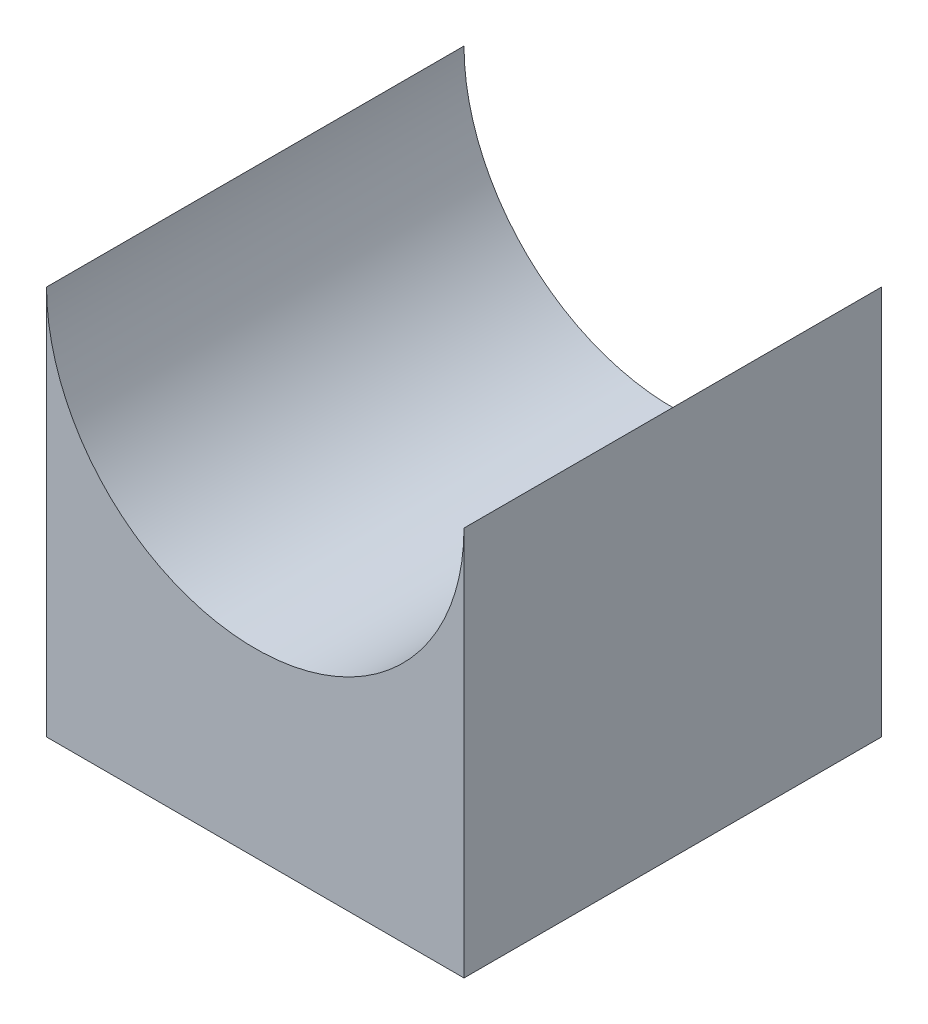
ISO-10303-21;
HEADER;
FILE_DESCRIPTION(('STEP AP214'),'2;1');
FILE_NAME('part.step','',(''),(''),'','','');
FILE_SCHEMA(('AUTOMOTIVE_DESIGN { 1 0 10303 214 1 1 1 1 }'));
ENDSEC;
DATA;
#1=APPLICATION_CONTEXT('core data for automotive mechanical design processes');
#2=APPLICATION_PROTOCOL_DEFINITION('international standard','automotive_design',2000,#1);
#3=PRODUCT_CONTEXT('',#1,'mechanical');
#4=PRODUCT('Part','Part','',(#3));
#5=PRODUCT_RELATED_PRODUCT_CATEGORY('part','',(#4));
#6=PRODUCT_DEFINITION_FORMATION('','',#4);
#7=PRODUCT_DEFINITION_CONTEXT('part definition',#1,'design');
#8=PRODUCT_DEFINITION('design','',#6,#7);
#9=PRODUCT_DEFINITION_SHAPE('','',#8);
#10=(LENGTH_UNIT() NAMED_UNIT(*) SI_UNIT(.MILLI.,.METRE.));
#11=(NAMED_UNIT(*) PLANE_ANGLE_UNIT() SI_UNIT($,.RADIAN.));
#12=(NAMED_UNIT(*) SI_UNIT($,.STERADIAN.) SOLID_ANGLE_UNIT());
#13=UNCERTAINTY_MEASURE_WITH_UNIT(LENGTH_MEASURE(1.E-05),#10,'distance_accuracy_value','');
#14=(GEOMETRIC_REPRESENTATION_CONTEXT(3) GLOBAL_UNCERTAINTY_ASSIGNED_CONTEXT((#13)) GLOBAL_UNIT_ASSIGNED_CONTEXT((#10,
#11,#12)) REPRESENTATION_CONTEXT('',''));
#15=CARTESIAN_POINT('',(0.,0.,0.));
#16=DIRECTION('',(0.,0.,1.));
#17=DIRECTION('',(1.,0.,0.));
#18=AXIS2_PLACEMENT_3D('',#15,#16,#17);
#19=CARTESIAN_POINT('',(0.,0.,3.));
#20=DIRECTION('',(-1.,0.,0.));
#21=DIRECTION('',(0.,0.,1.));
#22=AXIS2_PLACEMENT_3D('',#19,#20,#21);
#23=PLANE('',#22);
#24=DIRECTION('',(0.,1.,0.));
#25=VECTOR('',#24,1.);
#26=CARTESIAN_POINT('',(0.,0.,0.));
#27=LINE('',#26,#25);
#28=CARTESIAN_POINT('',(0.,0.,0.));
#29=VERTEX_POINT('',#28);
#30=CARTESIAN_POINT('',(0.,2.8,0.));
#31=VERTEX_POINT('',#30);
#32=EDGE_CURVE('E98',#29,#31,#27,.T.);
#33=ORIENTED_EDGE('',*,*,#32,.F.);
#34=DIRECTION('',(0.,0.,-1.));
#35=VECTOR('',#34,1.);
#36=CARTESIAN_POINT('',(0.,0.,3.));
#37=LINE('',#36,#35);
#38=CARTESIAN_POINT('',(0.,0.,3.));
#39=VERTEX_POINT('',#38);
#40=EDGE_CURVE('E11',#39,#29,#37,.T.);
#41=ORIENTED_EDGE('',*,*,#40,.F.);
#42=DIRECTION('',(0.,1.,0.));
#43=VECTOR('',#42,1.);
#44=CARTESIAN_POINT('',(0.,0.,3.));
#45=LINE('',#44,#43);
#46=CARTESIAN_POINT('',(0.,2.8,3.));
#47=VERTEX_POINT('',#46);
#48=EDGE_CURVE('E93',#39,#47,#45,.T.);
#49=ORIENTED_EDGE('',*,*,#48,.T.);
#50=DIRECTION('',(0.,0.,-1.));
#51=VECTOR('',#50,1.);
#52=CARTESIAN_POINT('',(0.,2.8,3.));
#53=LINE('',#52,#51);
#54=EDGE_CURVE('E36',#47,#31,#53,.T.);
#55=ORIENTED_EDGE('',*,*,#54,.T.);
#56=EDGE_LOOP('',(#33,#41,#49,#55));
#57=FACE_BOUND('',#56,.T.);
#58=ADVANCED_FACE('F33',(#57),#23,.T.);
#59=CARTESIAN_POINT('',(0.,0.,3.));
#60=DIRECTION('',(0.,1.,0.));
#61=DIRECTION('',(0.,0.,1.));
#62=AXIS2_PLACEMENT_3D('',#59,#60,#61);
#63=PLANE('',#62);
#64=DIRECTION('',(1.,0.,0.));
#65=VECTOR('',#64,1.);
#66=CARTESIAN_POINT('',(0.,0.,0.));
#67=LINE('',#66,#65);
#68=CARTESIAN_POINT('',(3.,0.,0.));
#69=VERTEX_POINT('',#68);
#70=EDGE_CURVE('E66',#29,#69,#67,.T.);
#71=ORIENTED_EDGE('',*,*,#70,.T.);
#72=DIRECTION('',(0.,0.,-1.));
#73=VECTOR('',#72,1.);
#74=CARTESIAN_POINT('',(3.,0.,3.));
#75=LINE('',#74,#73);
#76=CARTESIAN_POINT('',(3.,0.,3.));
#77=VERTEX_POINT('',#76);
#78=EDGE_CURVE('E42',#77,#69,#75,.T.);
#79=ORIENTED_EDGE('',*,*,#78,.F.);
#80=DIRECTION('',(1.,0.,0.));
#81=VECTOR('',#80,1.);
#82=CARTESIAN_POINT('',(0.,0.,3.));
#83=LINE('',#82,#81);
#84=EDGE_CURVE('E83',#39,#77,#83,.T.);
#85=ORIENTED_EDGE('',*,*,#84,.F.);
#86=ORIENTED_EDGE('',*,*,#40,.T.);
#87=EDGE_LOOP('',(#71,#79,#85,#86));
#88=FACE_BOUND('',#87,.T.);
#89=ADVANCED_FACE('F108',(#88),#63,.F.);
#90=CARTESIAN_POINT('',(3.,0.,3.));
#91=DIRECTION('',(-1.,0.,0.));
#92=DIRECTION('',(0.,-1.,0.));
#93=AXIS2_PLACEMENT_3D('',#90,#91,#92);
#94=PLANE('',#93);
#95=DIRECTION('',(0.,1.,0.));
#96=VECTOR('',#95,1.);
#97=CARTESIAN_POINT('',(3.,0.,0.));
#98=LINE('',#97,#96);
#99=CARTESIAN_POINT('',(3.,2.8,0.));
#100=VERTEX_POINT('',#99);
#101=EDGE_CURVE('E90',#69,#100,#98,.T.);
#102=ORIENTED_EDGE('',*,*,#101,.T.);
#103=DIRECTION('',(0.,0.,-1.));
#104=VECTOR('',#103,1.);
#105=CARTESIAN_POINT('',(3.,2.8,3.));
#106=LINE('',#105,#104);
#107=CARTESIAN_POINT('',(3.,2.8,3.));
#108=VERTEX_POINT('',#107);
#109=EDGE_CURVE('E87',#108,#100,#106,.T.);
#110=ORIENTED_EDGE('',*,*,#109,.F.);
#111=DIRECTION('',(0.,1.,0.));
#112=VECTOR('',#111,1.);
#113=CARTESIAN_POINT('',(3.,0.,3.));
#114=LINE('',#113,#112);
#115=EDGE_CURVE('E78',#77,#108,#114,.T.);
#116=ORIENTED_EDGE('',*,*,#115,.F.);
#117=ORIENTED_EDGE('',*,*,#78,.T.);
#118=EDGE_LOOP('',(#102,#110,#116,#117));
#119=FACE_BOUND('',#118,.T.);
#120=ADVANCED_FACE('F88',(#119),#94,.F.);
#121=CARTESIAN_POINT('',(1.5,2.8,3.));
#122=DIRECTION('',(0.,0.,-1.));
#123=DIRECTION('',(-1.,0.,0.));
#124=AXIS2_PLACEMENT_3D('',#121,#122,#123);
#125=CYLINDRICAL_SURFACE('',#124,1.5);
#126=CARTESIAN_POINT('',(1.5,2.8,0.));
#127=DIRECTION('',(0.,0.,1.));
#128=DIRECTION('',(1.,0.,0.));
#129=AXIS2_PLACEMENT_3D('',#126,#127,#128);
#130=CIRCLE('',#129,1.5);
#131=EDGE_CURVE('E101',#31,#100,#130,.T.);
#132=ORIENTED_EDGE('',*,*,#131,.F.);
#133=ORIENTED_EDGE('',*,*,#54,.F.);
#134=CARTESIAN_POINT('',(1.5,2.8,3.));
#135=DIRECTION('',(0.,0.,1.));
#136=DIRECTION('',(1.,0.,0.));
#137=AXIS2_PLACEMENT_3D('',#134,#135,#136);
#138=CIRCLE('',#137,1.5);
#139=EDGE_CURVE('E82',#47,#108,#138,.T.);
#140=ORIENTED_EDGE('',*,*,#139,.T.);
#141=ORIENTED_EDGE('',*,*,#109,.T.);
#142=EDGE_LOOP('',(#132,#133,#140,#141));
#143=FACE_BOUND('',#142,.T.);
#144=ADVANCED_FACE('F92',(#143),#125,.F.);
#145=CARTESIAN_POINT('',(1.5,2.8,3.));
#146=DIRECTION('',(0.,0.,1.));
#147=DIRECTION('',(1.,0.,0.));
#148=AXIS2_PLACEMENT_3D('',#145,#146,#147);
#149=PLANE('',#148);
#150=ORIENTED_EDGE('',*,*,#48,.F.);
#151=ORIENTED_EDGE('',*,*,#84,.T.);
#152=ORIENTED_EDGE('',*,*,#115,.T.);
#153=ORIENTED_EDGE('',*,*,#139,.F.);
#154=EDGE_LOOP('',(#150,#151,#152,#153));
#155=FACE_BOUND('',#154,.T.);
#156=ADVANCED_FACE('F81',(#155),#149,.T.);
#157=CARTESIAN_POINT('',(1.5,2.8,0.));
#158=DIRECTION('',(0.,0.,1.));
#159=DIRECTION('',(1.,0.,0.));
#160=AXIS2_PLACEMENT_3D('',#157,#158,#159);
#161=PLANE('',#160);
#162=ORIENTED_EDGE('',*,*,#32,.T.);
#163=ORIENTED_EDGE('',*,*,#131,.T.);
#164=ORIENTED_EDGE('',*,*,#101,.F.);
#165=ORIENTED_EDGE('',*,*,#70,.F.);
#166=EDGE_LOOP('',(#162,#163,#164,#165));
#167=FACE_BOUND('',#166,.T.);
#168=ADVANCED_FACE('F106',(#167),#161,.F.);
#169=CLOSED_SHELL('',(#58,#89,#120,#144,#156,#168));
#170=MANIFOLD_SOLID_BREP('B2',#169);
#171=ADVANCED_BREP_SHAPE_REPRESENTATION('',(#18,#170),#14);
#172=SHAPE_DEFINITION_REPRESENTATION(#9,#171);
ENDSEC;
END-ISO-10303-21;
